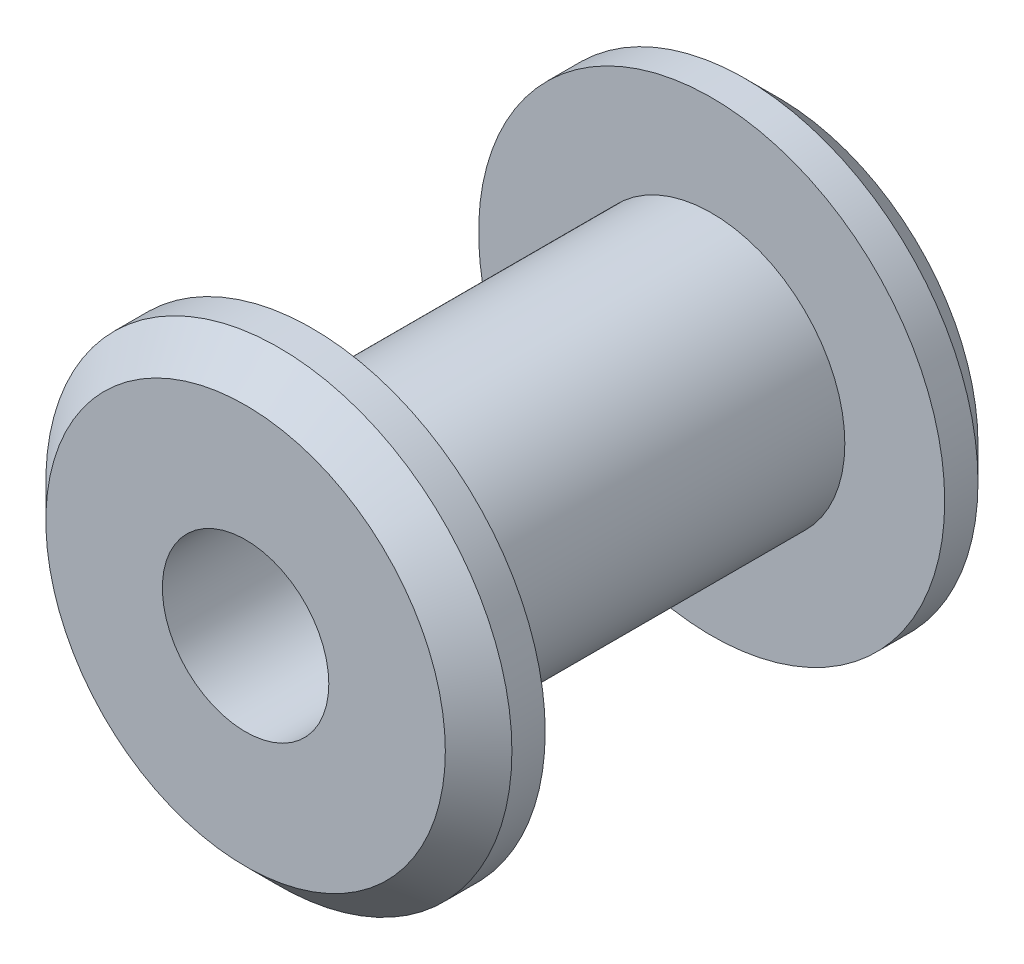
ISO-10303-21;
HEADER;
FILE_DESCRIPTION(('STEP AP214'),'2;1');
FILE_NAME('part.step','',(''),(''),'','','');
FILE_SCHEMA(('AUTOMOTIVE_DESIGN { 1 0 10303 214 1 1 1 1 }'));
ENDSEC;
DATA;
#1=APPLICATION_CONTEXT('core data for automotive mechanical design processes');
#2=APPLICATION_PROTOCOL_DEFINITION('international standard','automotive_design',2000,#1);
#3=PRODUCT_CONTEXT('',#1,'mechanical');
#4=PRODUCT('Part','Part','',(#3));
#5=PRODUCT_RELATED_PRODUCT_CATEGORY('part','',(#4));
#6=PRODUCT_DEFINITION_FORMATION('','',#4);
#7=PRODUCT_DEFINITION_CONTEXT('part definition',#1,'design');
#8=PRODUCT_DEFINITION('design','',#6,#7);
#9=PRODUCT_DEFINITION_SHAPE('','',#8);
#10=(LENGTH_UNIT() NAMED_UNIT(*) SI_UNIT(.MILLI.,.METRE.));
#11=(NAMED_UNIT(*) PLANE_ANGLE_UNIT() SI_UNIT($,.RADIAN.));
#12=(NAMED_UNIT(*) SI_UNIT($,.STERADIAN.) SOLID_ANGLE_UNIT());
#13=UNCERTAINTY_MEASURE_WITH_UNIT(LENGTH_MEASURE(1.E-05),#10,'distance_accuracy_value','');
#14=(GEOMETRIC_REPRESENTATION_CONTEXT(3) GLOBAL_UNCERTAINTY_ASSIGNED_CONTEXT((#13)) GLOBAL_UNIT_ASSIGNED_CONTEXT((#10,
#11,#12)) REPRESENTATION_CONTEXT('',''));
#15=CARTESIAN_POINT('',(0.,0.,0.));
#16=DIRECTION('',(0.,0.,1.));
#17=DIRECTION('',(1.,0.,0.));
#18=AXIS2_PLACEMENT_3D('',#15,#16,#17);
#19=CARTESIAN_POINT('',(0.,0.,6.));
#20=DIRECTION('',(0.,0.,-1.));
#21=DIRECTION('',(-1.,0.,0.));
#22=AXIS2_PLACEMENT_3D('',#19,#20,#21);
#23=CYLINDRICAL_SURFACE('',#22,4.);
#24=CARTESIAN_POINT('',(0.,0.,6.));
#25=DIRECTION('',(0.,0.,1.));
#26=DIRECTION('',(1.,0.,0.));
#27=AXIS2_PLACEMENT_3D('',#24,#25,#26);
#28=CIRCLE('',#27,4.);
#29=CARTESIAN_POINT('',(4.,0.,6.));
#30=VERTEX_POINT('',#29);
#31=EDGE_CURVE('E60',#30,#30,#28,.T.);
#32=ORIENTED_EDGE('',*,*,#31,.F.);
#33=EDGE_LOOP('',(#32));
#34=FACE_BOUND('',#33,.T.);
#35=CARTESIAN_POINT('',(0.,0.,-6.));
#36=DIRECTION('',(0.,0.,1.));
#37=DIRECTION('',(1.,0.,0.));
#38=AXIS2_PLACEMENT_3D('',#35,#36,#37);
#39=CIRCLE('',#38,4.);
#40=CARTESIAN_POINT('',(4.,0.,-6.));
#41=VERTEX_POINT('',#40);
#42=EDGE_CURVE('E61',#41,#41,#39,.T.);
#43=ORIENTED_EDGE('',*,*,#42,.T.);
#44=EDGE_LOOP('',(#43));
#45=FACE_BOUND('',#44,.T.);
#46=ADVANCED_FACE('F36',(#34,#45),#23,.T.);
#47=CARTESIAN_POINT('',(0.,0.,8.));
#48=DIRECTION('',(0.,0.,-1.));
#49=DIRECTION('',(-1.,0.,0.));
#50=AXIS2_PLACEMENT_3D('',#47,#48,#49);
#51=CYLINDRICAL_SURFACE('',#50,7.);
#52=CARTESIAN_POINT('',(0.,0.,6.99999999999999));
#53=DIRECTION('',(0.,0.,1.));
#54=DIRECTION('',(1.,0.,0.));
#55=AXIS2_PLACEMENT_3D('',#52,#53,#54);
#56=CIRCLE('',#55,7.);
#57=CARTESIAN_POINT('',(7.,0.,6.99999999999999));
#58=VERTEX_POINT('',#57);
#59=EDGE_CURVE('E10',#58,#58,#56,.F.);
#60=ORIENTED_EDGE('',*,*,#59,.T.);
#61=EDGE_LOOP('',(#60));
#62=FACE_BOUND('',#61,.T.);
#63=CARTESIAN_POINT('',(0.,0.,6.));
#64=DIRECTION('',(0.,0.,1.));
#65=DIRECTION('',(1.,0.,0.));
#66=AXIS2_PLACEMENT_3D('',#63,#64,#65);
#67=CIRCLE('',#66,7.);
#68=CARTESIAN_POINT('',(7.,0.,6.));
#69=VERTEX_POINT('',#68);
#70=EDGE_CURVE('E65',#69,#69,#67,.T.);
#71=ORIENTED_EDGE('',*,*,#70,.T.);
#72=EDGE_LOOP('',(#71));
#73=FACE_BOUND('',#72,.T.);
#74=ADVANCED_FACE('F90',(#62,#73),#51,.T.);
#75=CARTESIAN_POINT('',(0.,0.,8.));
#76=DIRECTION('',(0.,0.,1.));
#77=DIRECTION('',(1.,0.,0.));
#78=AXIS2_PLACEMENT_3D('',#75,#76,#77);
#79=PLANE('',#78);
#80=CARTESIAN_POINT('',(0.,0.,8.));
#81=DIRECTION('',(0.,0.,1.));
#82=DIRECTION('',(1.,0.,0.));
#83=AXIS2_PLACEMENT_3D('',#80,#81,#82);
#84=CIRCLE('',#83,5.99999999999999);
#85=CARTESIAN_POINT('',(5.99999999999999,0.,8.));
#86=VERTEX_POINT('',#85);
#87=EDGE_CURVE('E44',#86,#86,#84,.T.);
#88=ORIENTED_EDGE('',*,*,#87,.T.);
#89=EDGE_LOOP('',(#88));
#90=FACE_BOUND('',#89,.T.);
#91=CARTESIAN_POINT('',(0.,0.,8.));
#92=DIRECTION('',(0.,0.,1.));
#93=DIRECTION('',(1.,0.,0.));
#94=AXIS2_PLACEMENT_3D('',#91,#92,#93);
#95=CIRCLE('',#94,2.5);
#96=CARTESIAN_POINT('',(2.5,0.,8.));
#97=VERTEX_POINT('',#96);
#98=EDGE_CURVE('E80',#97,#97,#95,.T.);
#99=ORIENTED_EDGE('',*,*,#98,.F.);
#100=EDGE_LOOP('',(#99));
#101=FACE_BOUND('',#100,.T.);
#102=ADVANCED_FACE('F87',(#90,#101),#79,.T.);
#103=CARTESIAN_POINT('',(0.,0.,6.));
#104=DIRECTION('',(0.,0.,1.));
#105=DIRECTION('',(1.,0.,0.));
#106=AXIS2_PLACEMENT_3D('',#103,#104,#105);
#107=PLANE('',#106);
#108=ORIENTED_EDGE('',*,*,#31,.T.);
#109=EDGE_LOOP('',(#108));
#110=FACE_BOUND('',#109,.T.);
#111=ORIENTED_EDGE('',*,*,#70,.F.);
#112=EDGE_LOOP('',(#111));
#113=FACE_BOUND('',#112,.T.);
#114=ADVANCED_FACE('F89',(#110,#113),#107,.F.);
#115=CARTESIAN_POINT('',(0.,0.,-6.));
#116=DIRECTION('',(0.,0.,-1.));
#117=DIRECTION('',(-1.,0.,0.));
#118=AXIS2_PLACEMENT_3D('',#115,#116,#117);
#119=CYLINDRICAL_SURFACE('',#118,7.);
#120=CARTESIAN_POINT('',(0.,0.,-6.99999999999999));
#121=DIRECTION('',(0.,0.,1.));
#122=DIRECTION('',(1.,0.,0.));
#123=AXIS2_PLACEMENT_3D('',#120,#121,#122);
#124=CIRCLE('',#123,7.);
#125=CARTESIAN_POINT('',(7.,0.,-6.99999999999999));
#126=VERTEX_POINT('',#125);
#127=EDGE_CURVE('E54',#126,#126,#124,.T.);
#128=ORIENTED_EDGE('',*,*,#127,.T.);
#129=EDGE_LOOP('',(#128));
#130=FACE_BOUND('',#129,.T.);
#131=CARTESIAN_POINT('',(0.,0.,-6.));
#132=DIRECTION('',(0.,0.,1.));
#133=DIRECTION('',(1.,0.,0.));
#134=AXIS2_PLACEMENT_3D('',#131,#132,#133);
#135=CIRCLE('',#134,7.);
#136=CARTESIAN_POINT('',(7.,0.,-6.));
#137=VERTEX_POINT('',#136);
#138=EDGE_CURVE('E66',#137,#137,#135,.T.);
#139=ORIENTED_EDGE('',*,*,#138,.F.);
#140=EDGE_LOOP('',(#139));
#141=FACE_BOUND('',#140,.T.);
#142=ADVANCED_FACE('F97',(#130,#141),#119,.T.);
#143=CARTESIAN_POINT('',(0.,0.,-6.));
#144=DIRECTION('',(0.,0.,1.));
#145=DIRECTION('',(1.,0.,0.));
#146=AXIS2_PLACEMENT_3D('',#143,#144,#145);
#147=PLANE('',#146);
#148=ORIENTED_EDGE('',*,*,#42,.F.);
#149=EDGE_LOOP('',(#148));
#150=FACE_BOUND('',#149,.T.);
#151=ORIENTED_EDGE('',*,*,#138,.T.);
#152=EDGE_LOOP('',(#151));
#153=FACE_BOUND('',#152,.T.);
#154=ADVANCED_FACE('F126',(#150,#153),#147,.T.);
#155=CARTESIAN_POINT('',(0.,0.,-8.));
#156=DIRECTION('',(0.,0.,1.));
#157=DIRECTION('',(1.,0.,0.));
#158=AXIS2_PLACEMENT_3D('',#155,#156,#157);
#159=PLANE('',#158);
#160=CARTESIAN_POINT('',(0.,0.,-8.));
#161=DIRECTION('',(0.,0.,1.));
#162=DIRECTION('',(1.,0.,0.));
#163=AXIS2_PLACEMENT_3D('',#160,#161,#162);
#164=CIRCLE('',#163,5.99999999999999);
#165=CARTESIAN_POINT('',(5.99999999999999,0.,-8.));
#166=VERTEX_POINT('',#165);
#167=EDGE_CURVE('E49',#166,#166,#164,.F.);
#168=ORIENTED_EDGE('',*,*,#167,.T.);
#169=EDGE_LOOP('',(#168));
#170=FACE_BOUND('',#169,.T.);
#171=CARTESIAN_POINT('',(0.,0.,-8.));
#172=DIRECTION('',(0.,0.,1.));
#173=DIRECTION('',(1.,0.,0.));
#174=AXIS2_PLACEMENT_3D('',#171,#172,#173);
#175=CIRCLE('',#174,2.5);
#176=CARTESIAN_POINT('',(2.5,0.,-8.));
#177=VERTEX_POINT('',#176);
#178=EDGE_CURVE('E76',#177,#177,#175,.T.);
#179=ORIENTED_EDGE('',*,*,#178,.T.);
#180=EDGE_LOOP('',(#179));
#181=FACE_BOUND('',#180,.T.);
#182=ADVANCED_FACE('F118',(#170,#181),#159,.F.);
#183=CARTESIAN_POINT('',(0.,0.,-8.));
#184=DIRECTION('',(0.,0.,1.));
#185=DIRECTION('',(1.,0.,0.));
#186=AXIS2_PLACEMENT_3D('',#183,#184,#185);
#187=CYLINDRICAL_SURFACE('',#186,2.5);
#188=ORIENTED_EDGE('',*,*,#178,.F.);
#189=EDGE_LOOP('',(#188));
#190=FACE_BOUND('',#189,.T.);
#191=ORIENTED_EDGE('',*,*,#98,.T.);
#192=EDGE_LOOP('',(#191));
#193=FACE_BOUND('',#192,.T.);
#194=ADVANCED_FACE('F85',(#190,#193),#187,.F.);
#195=CARTESIAN_POINT('',(0.,0.,-6.99999999999999));
#196=DIRECTION('',(0.,0.,1.));
#197=DIRECTION('',(1.,0.,0.));
#198=AXIS2_PLACEMENT_3D('',#195,#196,#197);
#199=CONICAL_SURFACE('',#198,7.,0.78539816339745);
#200=ORIENTED_EDGE('',*,*,#167,.F.);
#201=EDGE_LOOP('',(#200));
#202=FACE_BOUND('',#201,.T.);
#203=ORIENTED_EDGE('',*,*,#127,.F.);
#204=EDGE_LOOP('',(#203));
#205=FACE_BOUND('',#204,.T.);
#206=ADVANCED_FACE('F110',(#202,#205),#199,.T.);
#207=CARTESIAN_POINT('',(0.,0.,8.));
#208=DIRECTION('',(0.,0.,-1.));
#209=DIRECTION('',(-1.,0.,0.));
#210=AXIS2_PLACEMENT_3D('',#207,#208,#209);
#211=CONICAL_SURFACE('',#210,5.99999999999999,0.785398163397447);
#212=ORIENTED_EDGE('',*,*,#59,.F.);
#213=EDGE_LOOP('',(#212));
#214=FACE_BOUND('',#213,.T.);
#215=ORIENTED_EDGE('',*,*,#87,.F.);
#216=EDGE_LOOP('',(#215));
#217=FACE_BOUND('',#216,.T.);
#218=ADVANCED_FACE('F38',(#214,#217),#211,.T.);
#219=CLOSED_SHELL('',(#46,#74,#102,#114,#142,#154,#182,#194,#206,#218));
#220=MANIFOLD_SOLID_BREP('B2',#219);
#221=ADVANCED_BREP_SHAPE_REPRESENTATION('',(#18,#220),#14);
#222=SHAPE_DEFINITION_REPRESENTATION(#9,#221);
ENDSEC;
END-ISO-10303-21;
